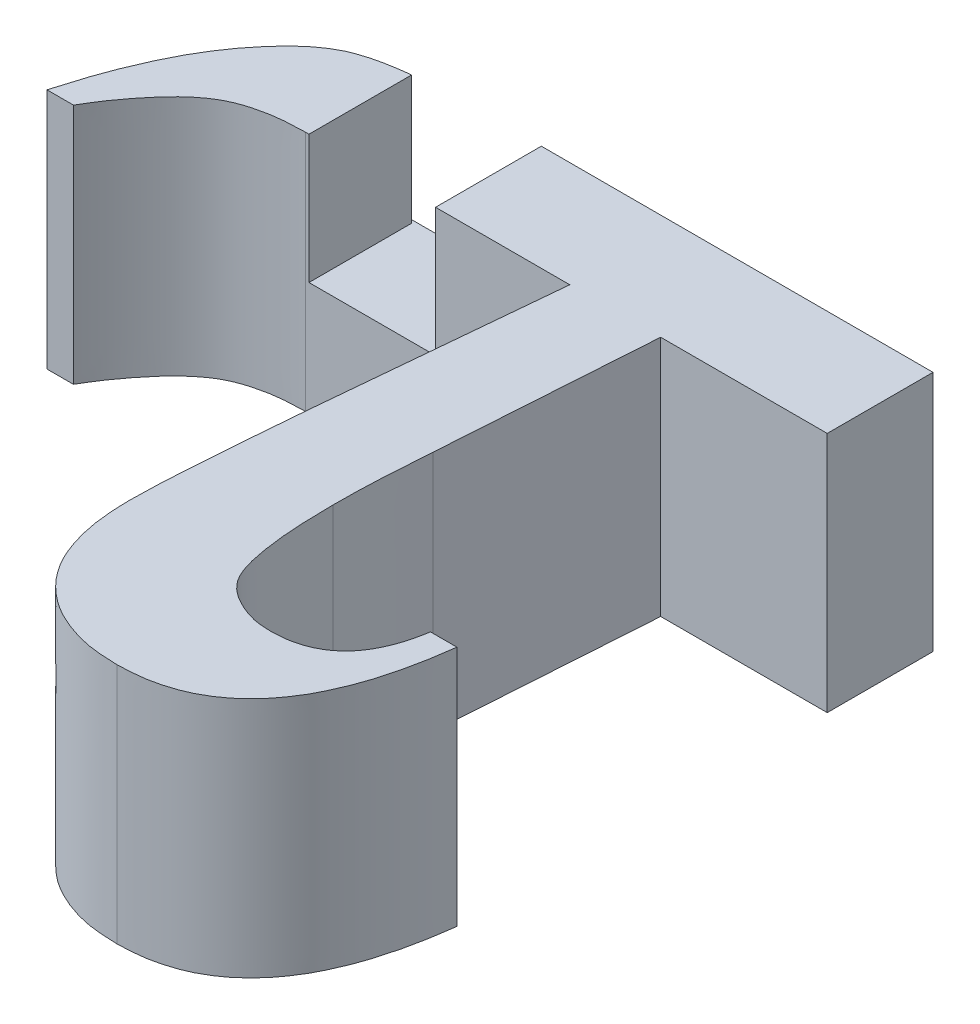
ISO-10303-21;
HEADER;
FILE_DESCRIPTION(('STEP AP214'),'2;1');
FILE_NAME('part.step','',(''),(''),'','','');
FILE_SCHEMA(('AUTOMOTIVE_DESIGN { 1 0 10303 214 1 1 1 1 }'));
ENDSEC;
DATA;
#1=APPLICATION_CONTEXT('core data for automotive mechanical design processes');
#2=APPLICATION_PROTOCOL_DEFINITION('international standard','automotive_design',2000,#1);
#3=PRODUCT_CONTEXT('',#1,'mechanical');
#4=PRODUCT('Part','Part','',(#3));
#5=PRODUCT_RELATED_PRODUCT_CATEGORY('part','',(#4));
#6=PRODUCT_DEFINITION_FORMATION('','',#4);
#7=PRODUCT_DEFINITION_CONTEXT('part definition',#1,'design');
#8=PRODUCT_DEFINITION('design','',#6,#7);
#9=PRODUCT_DEFINITION_SHAPE('','',#8);
#10=(LENGTH_UNIT() NAMED_UNIT(*) SI_UNIT(.MILLI.,.METRE.));
#11=(NAMED_UNIT(*) PLANE_ANGLE_UNIT() SI_UNIT($,.RADIAN.));
#12=(NAMED_UNIT(*) SI_UNIT($,.STERADIAN.) SOLID_ANGLE_UNIT());
#13=UNCERTAINTY_MEASURE_WITH_UNIT(LENGTH_MEASURE(1.E-05),#10,'distance_accuracy_value','');
#14=(GEOMETRIC_REPRESENTATION_CONTEXT(3) GLOBAL_UNCERTAINTY_ASSIGNED_CONTEXT((#13)) GLOBAL_UNIT_ASSIGNED_CONTEXT((#10,
#11,#12)) REPRESENTATION_CONTEXT('',''));
#15=CARTESIAN_POINT('',(0.,0.,0.));
#16=DIRECTION('',(0.,0.,1.));
#17=DIRECTION('',(1.,0.,0.));
#18=AXIS2_PLACEMENT_3D('',#15,#16,#17);
#19=CARTESIAN_POINT('',(13.2921006944444,12.7,-34.0277777777778));
#20=DIRECTION('',(0.,0.,-1.));
#21=DIRECTION('',(-1.,0.,0.));
#22=AXIS2_PLACEMENT_3D('',#19,#20,#21);
#23=PLANE('',#22);
#24=DIRECTION('',(1.,0.,0.));
#25=VECTOR('',#24,1.);
#26=CARTESIAN_POINT('',(13.2921006944444,0.,-34.0277777777778));
#27=LINE('',#26,#25);
#28=CARTESIAN_POINT('',(9.23728241617339,0.,-34.0277777777778));
#29=VERTEX_POINT('',#28);
#30=CARTESIAN_POINT('',(36.8055555555556,0.,-34.0277777777778));
#31=VERTEX_POINT('',#30);
#32=EDGE_CURVE('E272',#29,#31,#27,.T.);
#33=ORIENTED_EDGE('',*,*,#32,.F.);
#34=DIRECTION('',(0.,-1.,0.));
#35=VECTOR('',#34,1.);
#36=CARTESIAN_POINT('',(9.23728241617339,0.,-34.0277777777778));
#37=LINE('',#36,#35);
#38=CARTESIAN_POINT('',(9.23728241617339,5.95424376595588,-34.0277777777778));
#39=VERTEX_POINT('',#38);
#40=EDGE_CURVE('E457',#39,#29,#37,.T.);
#41=ORIENTED_EDGE('',*,*,#40,.F.);
#42=DIRECTION('',(1.,0.,0.));
#43=VECTOR('',#42,1.);
#44=CARTESIAN_POINT('',(9.23728241617339,5.95424376595588,-34.0277777777778));
#45=LINE('',#44,#43);
#46=CARTESIAN_POINT('',(16.2372824161734,5.95424376595588,-34.0277777777778));
#47=VERTEX_POINT('',#46);
#48=EDGE_CURVE('E453',#39,#47,#45,.T.);
#49=ORIENTED_EDGE('',*,*,#48,.T.);
#50=DIRECTION('',(0.,-1.,0.));
#51=VECTOR('',#50,1.);
#52=CARTESIAN_POINT('',(16.2372824161734,12.700012,-34.0277777777778));
#53=LINE('',#52,#51);
#54=CARTESIAN_POINT('',(16.2372824161734,12.7,-34.0277777777778));
#55=VERTEX_POINT('',#54);
#56=EDGE_CURVE('E440',#55,#47,#53,.T.);
#57=ORIENTED_EDGE('',*,*,#56,.F.);
#58=DIRECTION('',(1.,0.,0.));
#59=VECTOR('',#58,1.);
#60=CARTESIAN_POINT('',(13.2921006944444,12.7,-34.0277777777778));
#61=LINE('',#60,#59);
#62=CARTESIAN_POINT('',(36.8055555555556,12.7,-34.0277777777778));
#63=VERTEX_POINT('',#62);
#64=EDGE_CURVE('E464',#55,#63,#61,.T.);
#65=ORIENTED_EDGE('',*,*,#64,.T.);
#66=DIRECTION('',(0.,-1.,0.));
#67=VECTOR('',#66,1.);
#68=CARTESIAN_POINT('',(36.8055555555556,12.7,-34.0277777777778));
#69=LINE('',#68,#67);
#70=EDGE_CURVE('E467',#63,#31,#69,.T.);
#71=ORIENTED_EDGE('',*,*,#70,.T.);
#72=EDGE_LOOP('',(#33,#41,#49,#57,#65,#71));
#73=FACE_BOUND('',#72,.T.);
#74=ADVANCED_FACE('F33',(#73),#23,.T.);
#75=CARTESIAN_POINT('',(23.2855902777778,12.7,-28.4722222222222));
#76=DIRECTION('',(0.,0.,1.));
#77=DIRECTION('',(1.,0.,0.));
#78=AXIS2_PLACEMENT_3D('',#75,#76,#77);
#79=PLANE('',#78);
#80=DIRECTION('',(0.,-1.,0.));
#81=VECTOR('',#80,1.);
#82=CARTESIAN_POINT('',(9.40755208333333,12.7,-28.4722222222222));
#83=LINE('',#82,#81);
#84=CARTESIAN_POINT('',(9.40755208333333,12.7,-28.4722222222222));
#85=VERTEX_POINT('',#84);
#86=CARTESIAN_POINT('',(9.40755208333333,0.,-28.4722222222222));
#87=VERTEX_POINT('',#86);
#88=EDGE_CURVE('E200',#85,#87,#83,.T.);
#89=ORIENTED_EDGE('',*,*,#88,.T.);
#90=DIRECTION('',(-1.,0.,0.));
#91=VECTOR('',#90,1.);
#92=CARTESIAN_POINT('',(23.2855902777778,0.,-28.4722222222222));
#93=LINE('',#92,#91);
#94=CARTESIAN_POINT('',(23.2855902777778,0.,-28.4722222222222));
#95=VERTEX_POINT('',#94);
#96=EDGE_CURVE('E264',#95,#87,#93,.T.);
#97=ORIENTED_EDGE('',*,*,#96,.F.);
#98=DIRECTION('',(0.,-1.,0.));
#99=VECTOR('',#98,1.);
#100=CARTESIAN_POINT('',(23.2855902777778,12.7,-28.4722222222222));
#101=LINE('',#100,#99);
#102=CARTESIAN_POINT('',(23.2855902777778,12.7,-28.4722222222222));
#103=VERTEX_POINT('',#102);
#104=EDGE_CURVE('E282',#103,#95,#101,.T.);
#105=ORIENTED_EDGE('',*,*,#104,.F.);
#106=DIRECTION('',(-1.,0.,0.));
#107=VECTOR('',#106,1.);
#108=CARTESIAN_POINT('',(23.2855902777778,12.7,-28.4722222222222));
#109=LINE('',#108,#107);
#110=CARTESIAN_POINT('',(16.2372824161734,12.7,-28.4722222222222));
#111=VERTEX_POINT('',#110);
#112=EDGE_CURVE('E278',#103,#111,#109,.T.);
#113=ORIENTED_EDGE('',*,*,#112,.T.);
#114=DIRECTION('',(0.,-1.,0.));
#115=VECTOR('',#114,1.);
#116=CARTESIAN_POINT('',(16.2372824161734,12.700012,-28.4722222222222));
#117=LINE('',#116,#115);
#118=CARTESIAN_POINT('',(16.2372824161734,5.95424376595588,-28.4722222222222));
#119=VERTEX_POINT('',#118);
#120=EDGE_CURVE('E273',#111,#119,#117,.T.);
#121=ORIENTED_EDGE('',*,*,#120,.T.);
#122=DIRECTION('',(1.,0.,0.));
#123=VECTOR('',#122,1.);
#124=CARTESIAN_POINT('',(9.23728241617339,5.95424376595588,-28.4722222222222));
#125=LINE('',#124,#123);
#126=CARTESIAN_POINT('',(9.59139239565676,5.95424376595588,-28.4722222222222));
#127=VERTEX_POINT('',#126);
#128=EDGE_CURVE('E56',#127,#119,#125,.T.);
#129=ORIENTED_EDGE('',*,*,#128,.F.);
#130=DIRECTION('',(0.,-1.,0.));
#131=VECTOR('',#130,1.);
#132=CARTESIAN_POINT('',(9.59139239565676,12.700012,-28.4722222222222));
#133=LINE('',#132,#131);
#134=CARTESIAN_POINT('',(9.59139239565676,12.7,-28.4722222222222));
#135=VERTEX_POINT('',#134);
#136=EDGE_CURVE('E182',#135,#127,#133,.T.);
#137=ORIENTED_EDGE('',*,*,#136,.F.);
#138=DIRECTION('',(-1.,0.,0.));
#139=VECTOR('',#138,1.);
#140=CARTESIAN_POINT('',(11.8055555555556,12.7,-28.4722222222222));
#141=LINE('',#140,#139);
#142=EDGE_CURVE('E192',#135,#85,#141,.T.);
#143=ORIENTED_EDGE('',*,*,#142,.T.);
#144=EDGE_LOOP('',(#89,#97,#105,#113,#121,#129,#137,#143));
#145=FACE_BOUND('',#144,.T.);
#146=ADVANCED_FACE('F263',(#145),#79,.T.);
#147=CARTESIAN_POINT('',(27.1472873942856,12.7,-14.7536617724148));
#148=DIRECTION('',(0.,-1.,0.));
#149=DIRECTION('',(0.,0.,-1.));
#150=AXIS2_PLACEMENT_3D('',#147,#148,#149);
#151=PLANE('',#150);
#152=DIRECTION('',(0.,0.,1.));
#153=VECTOR('',#152,1.);
#154=CARTESIAN_POINT('',(16.2372824161734,12.7,0.));
#155=LINE('',#154,#153);
#156=EDGE_CURVE('E442',#111,#55,#155,.F.);
#157=ORIENTED_EDGE('',*,*,#156,.F.);
#158=ORIENTED_EDGE('',*,*,#112,.F.);
#159=DIRECTION('',(0.0934043008907482,0.,-0.995628262242043));
#160=VECTOR('',#159,1.);
#161=CARTESIAN_POINT('',(22.2981770833333,12.7,-17.9470486111111));
#162=LINE('',#161,#160);
#163=CARTESIAN_POINT('',(22.2981770833333,12.7,-17.9470486111111));
#164=VERTEX_POINT('',#163);
#165=EDGE_CURVE('E285',#164,#103,#162,.T.);
#166=ORIENTED_EDGE('',*,*,#165,.F.);
#167=CARTESIAN_POINT('',(21.5277777777778,12.7,-7.12890625));
#168=CARTESIAN_POINT('',(21.5305114105295,12.7,-7.3712541198442));
#169=CARTESIAN_POINT('',(21.5366740874699,12.7,-7.91760096473992));
#170=CARTESIAN_POINT('',(21.5693216726704,12.7,-8.8258732238135));
#171=CARTESIAN_POINT('',(21.639359606474,12.7,-9.91058564289095));
#172=CARTESIAN_POINT('',(21.7259965981165,12.7,-11.1729046276854));
#173=CARTESIAN_POINT('',(21.83463501765,12.7,-12.6124561829459));
#174=CARTESIAN_POINT('',(21.9665895696574,12.7,-14.2326908476133));
#175=CARTESIAN_POINT('',(22.1147351358337,12.7,-16.0309685855275));
#176=CARTESIAN_POINT('',(22.2351680357019,12.7,-17.2889091874774));
#177=CARTESIAN_POINT('',(22.2981770833333,12.7,-17.9470486111111));
#178=B_SPLINE_CURVE_WITH_KNOTS('',3,(#167,#168,#169,#170,#171,#172,#173,#174,#175,#176,#177),
.UNSPECIFIED.,.F.,.F.,(4,1,1,1,1,1,1,1,4),(0.,0.0670238303360388,0.151097916645444,
0.251302226093075,0.367606163812109,0.501014153754002,0.65053310860966,0.817163117143853,1.),.UNSPECIFIED.);
#179=CARTESIAN_POINT('',(21.5277777777778,12.7,-7.12890625));
#180=VERTEX_POINT('',#179);
#181=EDGE_CURVE('E346',#180,#164,#178,.T.);
#182=ORIENTED_EDGE('',*,*,#181,.F.);
#183=CARTESIAN_POINT('',(28.6675347222222,12.7,0.694444444444444));
#184=CARTESIAN_POINT('',(28.1546828613466,12.7,0.675816782086769));
#185=CARTESIAN_POINT('',(27.1641312430192,12.7,0.639838242275));
#186=CARTESIAN_POINT('',(25.7663350443405,12.7,0.242024900702383));
#187=CARTESIAN_POINT('',(24.5121456190193,12.7,-0.369174112416068));
#188=CARTESIAN_POINT('',(23.6216090508016,12.7,-1.10102614918808));
#189=CARTESIAN_POINT('',(23.0102559111378,12.7,-1.79721088235984));
#190=CARTESIAN_POINT('',(22.6098523705465,12.7,-2.38381706075308));
#191=CARTESIAN_POINT('',(22.2684789361821,12.7,-3.03085897121243));
#192=CARTESIAN_POINT('',(22.0031010816414,12.7,-3.74048733214159));
#193=CARTESIAN_POINT('',(21.7829659020023,12.7,-4.50131584322859));
#194=CARTESIAN_POINT('',(21.632459474962,12.7,-5.32264207193387));
#195=CARTESIAN_POINT('',(21.5478756365024,12.7,-6.20479876889942));
#196=CARTESIAN_POINT('',(21.534625409571,12.7,-6.81404943591648));
#197=CARTESIAN_POINT('',(21.5277777777778,12.7,-7.12890625));
#198=B_SPLINE_CURVE_WITH_KNOTS('',3,(#183,#184,#185,#186,#187,#188,#189,#190,#191,#192,#193,
#194,#195,#196,#197),.UNSPECIFIED.,.F.,.F.,(4,1,1,1,1,1,1,1,1,1,1,1,4),(0.,0.127647226661698,
0.246545204552585,0.359563226304089,0.473742938345104,0.531308817831562,0.590390123598073,
0.650544045709061,0.713399872205537,0.779107018641923,0.847968041860642,0.921430864880289,1.),.UNSPECIFIED.);
#199=CARTESIAN_POINT('',(28.6675347222222,12.7,0.694444444444444));
#200=VERTEX_POINT('',#199);
#201=EDGE_CURVE('E353',#200,#180,#198,.T.);
#202=ORIENTED_EDGE('',*,*,#201,.F.);
#203=CARTESIAN_POINT('',(36.8055555555556,12.7,-9.02777777777778));
#204=CARTESIAN_POINT('',(36.7513133917469,12.7,-8.63659364157587));
#205=CARTESIAN_POINT('',(36.6454306414474,12.7,-7.87298744841802));
#206=CARTESIAN_POINT('',(36.4309932767515,12.7,-6.77107907621159));
#207=CARTESIAN_POINT('',(36.16669150045,12.7,-5.74350517199164));
#208=CARTESIAN_POINT('',(35.8738258854762,12.7,-4.78809617206142));
#209=CARTESIAN_POINT('',(35.5036386424438,12.7,-3.9183087219052));
#210=CARTESIAN_POINT('',(35.1264384283411,12.7,-3.10889015714418));
#211=CARTESIAN_POINT('',(34.6702223597116,12.7,-2.39005292028029));
#212=CARTESIAN_POINT('',(34.1904600364056,12.7,-1.73473575157518));
#213=CARTESIAN_POINT('',(33.6477015498479,12.7,-1.16770850492629));
#214=CARTESIAN_POINT('',(33.078282467188,12.7,-0.66136398505755));
#215=CARTESIAN_POINT('',(32.4475265168622,12.7,-0.251271838106295));
#216=CARTESIAN_POINT('',(31.7856191750121,12.7,0.107880779261864));
#217=CARTESIAN_POINT('',(31.0640591850801,12.7,0.356214557009295));
#218=CARTESIAN_POINT('',(30.3088261221695,12.7,0.56350053559861));
#219=CARTESIAN_POINT('',(29.5020634030454,12.7,0.664205140721047));
#220=CARTESIAN_POINT('',(28.9498434871648,12.7,0.684214933244837));
#221=CARTESIAN_POINT('',(28.6675347222222,12.7,0.694444444444444));
#222=B_SPLINE_CURVE_WITH_KNOTS('',3,(#203,#204,#205,#206,#207,#208,#209,#210,#211,#212,#213,
#214,#215,#216,#217,#218,#219,#220,#221),.UNSPECIFIED.,.F.,.F.,(4,1,1,1,1,1,1,1,1,1,1,1,1,1,1,1,
4),(0.,0.0841556864895232,0.164275075203153,0.239055219457782,0.310237014412085,
0.376941840256964,0.440373169741991,0.500263392341492,0.558073875988856,0.613147443853041,
0.667241364146044,0.720045825452029,0.773142026333451,0.827274375356327,0.882239955728648,
0.93979809184389,1.),.UNSPECIFIED.);
#223=CARTESIAN_POINT('',(36.8055555555556,12.7,-9.02777777777778));
#224=VERTEX_POINT('',#223);
#225=EDGE_CURVE('E484',#224,#200,#222,.T.);
#226=ORIENTED_EDGE('',*,*,#225,.F.);
#227=DIRECTION('',(1.,0.,0.));
#228=VECTOR('',#227,1.);
#229=CARTESIAN_POINT('',(35.4166666666667,12.7,-9.02777777777778));
#230=LINE('',#229,#228);
#231=CARTESIAN_POINT('',(35.4166666666667,12.7,-9.02777777777778));
#232=VERTEX_POINT('',#231);
#233=EDGE_CURVE('E481',#232,#224,#230,.T.);
#234=ORIENTED_EDGE('',*,*,#233,.F.);
#235=CARTESIAN_POINT('',(31.1957465277778,12.7,-4.86111111111111));
#236=CARTESIAN_POINT('',(31.4791658501184,12.7,-4.8721360880485));
#237=CARTESIAN_POINT('',(32.020929674091,12.7,-4.89321063446786));
#238=CARTESIAN_POINT('',(32.7882207905975,12.7,-5.09409905053723));
#239=CARTESIAN_POINT('',(33.4661075286299,12.7,-5.42321156735885));
#240=CARTESIAN_POINT('',(34.0525941602721,12.7,-5.89132585546645));
#241=CARTESIAN_POINT('',(34.5489539983316,12.7,-6.48840022572338));
#242=CARTESIAN_POINT('',(34.9362207251512,12.7,-7.22238630970373));
#243=CARTESIAN_POINT('',(35.2449863982341,12.7,-8.07647376134501));
#244=CARTESIAN_POINT('',(35.3574861135008,12.7,-8.69985018053333));
#245=CARTESIAN_POINT('',(35.4166666666667,12.7,-9.02777777777778));
#246=B_SPLINE_CURVE_WITH_KNOTS('',3,(#235,#236,#237,#238,#239,#240,#241,#242,#243,#244,#245),
.UNSPECIFIED.,.F.,.F.,(4,1,1,1,1,1,1,1,4),(0.,0.129205983290068,0.246980788074976,
0.35925367724387,0.470941934680579,0.587037155352566,0.711204670771874,0.848079016956545,1.),.UNSPECIFIED.);
#247=CARTESIAN_POINT('',(31.1957465277778,12.7,-4.86111111111111));
#248=VERTEX_POINT('',#247);
#249=EDGE_CURVE('E478',#248,#232,#246,.T.);
#250=ORIENTED_EDGE('',*,*,#249,.F.);
#251=CARTESIAN_POINT('',(27.0833333333333,12.7,-12.2287326388889));
#252=CARTESIAN_POINT('',(27.0882745812644,12.7,-11.8236043185145));
#253=CARTESIAN_POINT('',(27.0976765216824,12.7,-11.052747971514));
#254=CARTESIAN_POINT('',(27.1463748998904,12.7,-9.95891993945998));
#255=CARTESIAN_POINT('',(27.2451702705584,12.7,-8.98875586176693));
#256=CARTESIAN_POINT('',(27.3710026926128,12.7,-8.14392613457271));
#257=CARTESIAN_POINT('',(27.5291522325583,12.7,-7.41943052756003));
#258=CARTESIAN_POINT('',(27.7284573341644,12.7,-6.81830163856045));
#259=CARTESIAN_POINT('',(27.9765063600137,12.7,-6.33946446408178));
#260=CARTESIAN_POINT('',(28.3522272213898,12.7,-5.8784454175766));
#261=CARTESIAN_POINT('',(28.9025466939934,12.7,-5.47047020970769));
#262=CARTESIAN_POINT('',(29.6120223329737,12.7,-5.12581615996723));
#263=CARTESIAN_POINT('',(30.3815459637492,12.7,-4.88809905815676));
#264=CARTESIAN_POINT('',(30.9190270918066,12.7,-4.87028340822614));
#265=CARTESIAN_POINT('',(31.1957465277778,12.7,-4.86111111111111));
#266=B_SPLINE_CURVE_WITH_KNOTS('',3,(#251,#252,#253,#254,#255,#256,#257,#258,#259,#260,#261,
#262,#263,#264,#265),.UNSPECIFIED.,.F.,.F.,(4,1,1,1,1,1,1,1,1,1,1,1,4),(0.,0.125676685120686,
0.239130827254309,0.339492232966841,0.42803269094699,0.503968671969276,0.56925330075194,
0.623964141319684,0.670222681451672,0.752583670617675,0.83386779813621,0.914467677474434,1.),.UNSPECIFIED.);
#267=CARTESIAN_POINT('',(27.0833333333333,12.7,-12.2287326388889));
#268=VERTEX_POINT('',#267);
#269=EDGE_CURVE('E420',#268,#248,#266,.T.);
#270=ORIENTED_EDGE('',*,*,#269,.F.);
#271=CARTESIAN_POINT('',(27.3111979166667,12.7,-17.2743055555556));
#272=CARTESIAN_POINT('',(27.2777956556052,12.7,-16.8041666391725));
#273=CARTESIAN_POINT('',(27.2135818740465,12.7,-15.9003536421008));
#274=CARTESIAN_POINT('',(27.1342842848992,12.7,-14.5912792307124));
#275=CARTESIAN_POINT('',(27.0883448225416,12.7,-13.379251722667));
#276=CARTESIAN_POINT('',(27.0849562140775,12.7,-12.6013075740456));
#277=CARTESIAN_POINT('',(27.0833333333333,12.7,-12.2287326388889));
#278=B_SPLINE_CURVE_WITH_KNOTS('',3,(#271,#272,#273,#274,#275,#276,#277),.UNSPECIFIED.,.F.,.F.,
(4,1,1,1,4),(0.,0.279883091977313,0.538057938568128,0.778765565768248,1.),.UNSPECIFIED.);
#279=CARTESIAN_POINT('',(27.3111979166667,12.7,-17.2743055555556));
#280=VERTEX_POINT('',#279);
#281=EDGE_CURVE('E412',#280,#268,#278,.T.);
#282=ORIENTED_EDGE('',*,*,#281,.F.);
#283=DIRECTION('',(-0.0667115204065151,0.,0.997772305210488));
#284=VECTOR('',#283,1.);
#285=CARTESIAN_POINT('',(28.0598958333333,12.7,-28.4722222222222));
#286=LINE('',#285,#284);
#287=CARTESIAN_POINT('',(28.0598958333333,12.7,-28.4722222222222));
#288=VERTEX_POINT('',#287);
#289=EDGE_CURVE('E425',#288,#280,#286,.T.);
#290=ORIENTED_EDGE('',*,*,#289,.F.);
#291=DIRECTION('',(-1.,0.,0.));
#292=VECTOR('',#291,1.);
#293=CARTESIAN_POINT('',(36.8055555555556,12.7,-28.4722222222222));
#294=LINE('',#293,#292);
#295=CARTESIAN_POINT('',(36.8055555555556,12.7,-28.4722222222222));
#296=VERTEX_POINT('',#295);
#297=EDGE_CURVE('E432',#296,#288,#294,.T.);
#298=ORIENTED_EDGE('',*,*,#297,.F.);
#299=DIRECTION('',(0.,0.,1.));
#300=VECTOR('',#299,1.);
#301=CARTESIAN_POINT('',(36.8055555555556,12.7,-34.0277777777778));
#302=LINE('',#301,#300);
#303=EDGE_CURVE('E436',#63,#296,#302,.T.);
#304=ORIENTED_EDGE('',*,*,#303,.F.);
#305=ORIENTED_EDGE('',*,*,#64,.F.);
#306=EDGE_LOOP('',(#157,#158,#166,#182,#202,#226,#234,#250,#270,#282,#290,#298,#304,#305));
#307=FACE_BOUND('',#306,.T.);
#308=ADVANCED_FACE('F35',(#307),#151,.F.);
#309=CARTESIAN_POINT('',(27.1472873942856,0.,-14.7536617724148));
#310=DIRECTION('',(0.,-1.,0.));
#311=DIRECTION('',(0.,0.,-1.));
#312=AXIS2_PLACEMENT_3D('',#309,#310,#311);
#313=PLANE('',#312);
#314=ORIENTED_EDGE('',*,*,#96,.T.);
#315=CARTESIAN_POINT('',(9.40755208333333,0.,-28.4722222222222));
#316=CARTESIAN_POINT('',(8.95408519576781,0.,-28.4606206709391));
#317=CARTESIAN_POINT('',(8.09430128908974,0.,-28.4386238562671));
#318=CARTESIAN_POINT('',(6.89073280513659,0.,-28.1966385268821));
#319=CARTESIAN_POINT('',(5.84213085109311,0.,-27.8179401102908));
#320=CARTESIAN_POINT('',(4.96956885236203,0.,-27.2299365275539));
#321=CARTESIAN_POINT('',(4.19796483569046,0.,-26.5149213859107));
#322=CARTESIAN_POINT('',(3.4764642398158,0.,-25.6630991056384));
#323=CARTESIAN_POINT('',(2.73941358764486,0.,-24.7044655684062));
#324=CARTESIAN_POINT('',(2.30762444937789,0.,-23.9848911324537));
#325=CARTESIAN_POINT('',(2.08333333333333,0.,-23.6111111111111));
#326=B_SPLINE_CURVE_WITH_KNOTS('',3,(#315,#316,#317,#318,#319,#320,#321,#322,#323,#324,#325),
.UNSPECIFIED.,.F.,.F.,(4,1,1,1,1,1,1,1,4),(0.,0.145583771362849,0.276030261797652,
0.393080050750592,0.501449771885324,0.611742725661537,0.730433023859637,0.859974527914375,1.),.UNSPECIFIED.);
#327=CARTESIAN_POINT('',(2.08333333333333,0.,-23.6111111111111));
#328=VERTEX_POINT('',#327);
#329=EDGE_CURVE('E193',#87,#328,#326,.T.);
#330=ORIENTED_EDGE('',*,*,#329,.T.);
#331=DIRECTION('',(-1.,0.,0.));
#332=VECTOR('',#331,1.);
#333=CARTESIAN_POINT('',(2.08333333333333,0.,-23.6111111111111));
#334=LINE('',#333,#332);
#335=CARTESIAN_POINT('',(0.694444444444444,0.,-23.6111111111111));
#336=VERTEX_POINT('',#335);
#337=EDGE_CURVE('E240',#328,#336,#334,.T.);
#338=ORIENTED_EDGE('',*,*,#337,.T.);
#339=CARTESIAN_POINT('',(0.694444444444444,0.,-23.6111111111111));
#340=CARTESIAN_POINT('',(0.877085400927211,0.,-24.2325973935134));
#341=CARTESIAN_POINT('',(1.22929100018624,0.,-25.4310741905039));
#342=CARTESIAN_POINT('',(1.88626697778044,0.,-27.1198883334908));
#343=CARTESIAN_POINT('',(2.60411941982457,0.,-28.6425685555125));
#344=CARTESIAN_POINT('',(3.40397478963898,0.,-29.9807064863556));
#345=CARTESIAN_POINT('',(4.25911175599265,0.,-31.1159816153702));
#346=CARTESIAN_POINT('',(5.11851784470723,0.,-32.0589555969846));
#347=CARTESIAN_POINT('',(5.99667254096802,0.,-32.7858615843168));
#348=CARTESIAN_POINT('',(6.77259028848232,0.,-33.2248506339241));
#349=CARTESIAN_POINT('',(7.44907428146499,0.,-33.4555232845119));
#350=CARTESIAN_POINT('',(8.02710412470257,0.,-33.6193269548779));
#351=CARTESIAN_POINT('',(8.69603133437619,0.,-33.7433975237279));
#352=CARTESIAN_POINT('',(9.44462384368619,0.,-33.8557901627339));
#353=CARTESIAN_POINT('',(10.2860205496014,0.,-33.9218814942938));
#354=CARTESIAN_POINT('',(11.2112875792302,0.,-33.9939424882169));
#355=CARTESIAN_POINT('',(12.2249683095544,0.,-34.020966417384));
#356=CARTESIAN_POINT('',(12.926797760704,0.,-34.0254460990003));
#357=CARTESIAN_POINT('',(13.2921006944444,0.,-34.0277777777778));
#358=B_SPLINE_CURVE_WITH_KNOTS('',3,(#339,#340,#341,#342,#343,#344,#345,#346,#347,#348,#349,
#350,#351,#352,#353,#354,#355,#356,#357),.UNSPECIFIED.,.F.,.F.,(4,1,1,1,1,1,1,1,1,1,1,1,1,1,1,1,
4),(0.,0.106389814768358,0.205162572443508,0.297397502260976,0.382702081516378,
0.460789650769703,0.530590808939293,0.5918470728537,0.647433049944165,0.675815421325624,
0.709121231619287,0.746066666669912,0.787499901970603,0.833447624649006,0.884679338709788,
0.939975480052583,1.),.UNSPECIFIED.);
#359=CARTESIAN_POINT('',(9.23728241617339,0.,-33.820866412652));
#360=VERTEX_POINT('',#359);
#361=EDGE_CURVE('E246',#336,#360,#358,.T.);
#362=ORIENTED_EDGE('',*,*,#361,.T.);
#363=DIRECTION('',(0.,0.,1.));
#364=VECTOR('',#363,1.);
#365=CARTESIAN_POINT('',(9.23728241617339,0.,-34.0277777777778));
#366=LINE('',#365,#364);
#367=EDGE_CURVE('E451',#29,#360,#366,.T.);
#368=ORIENTED_EDGE('',*,*,#367,.F.);
#369=ORIENTED_EDGE('',*,*,#32,.T.);
#370=DIRECTION('',(0.,0.,1.));
#371=VECTOR('',#370,1.);
#372=CARTESIAN_POINT('',(36.8055555555556,0.,-34.0277777777778));
#373=LINE('',#372,#371);
#374=CARTESIAN_POINT('',(36.8055555555556,0.,-28.4722222222222));
#375=VERTEX_POINT('',#374);
#376=EDGE_CURVE('E275',#31,#375,#373,.T.);
#377=ORIENTED_EDGE('',*,*,#376,.T.);
#378=DIRECTION('',(-1.,0.,0.));
#379=VECTOR('',#378,1.);
#380=CARTESIAN_POINT('',(36.8055555555556,0.,-28.4722222222222));
#381=LINE('',#380,#379);
#382=CARTESIAN_POINT('',(28.0598958333333,0.,-28.4722222222222));
#383=VERTEX_POINT('',#382);
#384=EDGE_CURVE('E339',#375,#383,#381,.T.);
#385=ORIENTED_EDGE('',*,*,#384,.T.);
#386=DIRECTION('',(-0.0667115204065151,0.,0.997772305210488));
#387=VECTOR('',#386,1.);
#388=CARTESIAN_POINT('',(28.0598958333333,0.,-28.4722222222222));
#389=LINE('',#388,#387);
#390=CARTESIAN_POINT('',(27.3111979166667,0.,-17.2743055555556));
#391=VERTEX_POINT('',#390);
#392=EDGE_CURVE('E333',#383,#391,#389,.T.);
#393=ORIENTED_EDGE('',*,*,#392,.T.);
#394=CARTESIAN_POINT('',(27.3111979166667,0.,-17.2743055555556));
#395=CARTESIAN_POINT('',(27.2777956556052,0.,-16.8041666391725));
#396=CARTESIAN_POINT('',(27.2135818740465,0.,-15.9003536421008));
#397=CARTESIAN_POINT('',(27.1342842848992,0.,-14.5912792307124));
#398=CARTESIAN_POINT('',(27.0883448225416,0.,-13.379251722667));
#399=CARTESIAN_POINT('',(27.0849562140775,0.,-12.6013075740456));
#400=CARTESIAN_POINT('',(27.0833333333333,0.,-12.2287326388889));
#401=B_SPLINE_CURVE_WITH_KNOTS('',3,(#394,#395,#396,#397,#398,#399,#400),.UNSPECIFIED.,.F.,.F.,
(4,1,1,1,4),(0.,0.279883091977313,0.538057938568128,0.778765565768248,1.),.UNSPECIFIED.);
#402=CARTESIAN_POINT('',(27.0833333333333,0.,-12.2287326388889));
#403=VERTEX_POINT('',#402);
#404=EDGE_CURVE('E325',#391,#403,#401,.T.);
#405=ORIENTED_EDGE('',*,*,#404,.T.);
#406=CARTESIAN_POINT('',(27.0833333333333,0.,-12.2287326388889));
#407=CARTESIAN_POINT('',(27.0882745812644,0.,-11.8236043185145));
#408=CARTESIAN_POINT('',(27.0976765216824,0.,-11.052747971514));
#409=CARTESIAN_POINT('',(27.1463748998904,0.,-9.95891993945998));
#410=CARTESIAN_POINT('',(27.2451702705584,0.,-8.98875586176693));
#411=CARTESIAN_POINT('',(27.3710026926128,0.,-8.14392613457271));
#412=CARTESIAN_POINT('',(27.5291522325583,0.,-7.41943052756003));
#413=CARTESIAN_POINT('',(27.7284573341644,0.,-6.81830163856045));
#414=CARTESIAN_POINT('',(27.9765063600137,0.,-6.33946446408178));
#415=CARTESIAN_POINT('',(28.3522272213898,0.,-5.8784454175766));
#416=CARTESIAN_POINT('',(28.9025466939934,0.,-5.47047020970769));
#417=CARTESIAN_POINT('',(29.6120223329737,0.,-5.12581615996723));
#418=CARTESIAN_POINT('',(30.3815459637492,0.,-4.88809905815676));
#419=CARTESIAN_POINT('',(30.9190270918066,0.,-4.87028340822614));
#420=CARTESIAN_POINT('',(31.1957465277778,0.,-4.86111111111111));
#421=B_SPLINE_CURVE_WITH_KNOTS('',3,(#406,#407,#408,#409,#410,#411,#412,#413,#414,#415,#416,
#417,#418,#419,#420),.UNSPECIFIED.,.F.,.F.,(4,1,1,1,1,1,1,1,1,1,1,1,4),(0.,0.125676685120686,
0.239130827254309,0.339492232966841,0.42803269094699,0.503968671969276,0.56925330075194,
0.623964141319684,0.670222681451672,0.752583670617675,0.83386779813621,0.914467677474434,1.),.UNSPECIFIED.);
#422=CARTESIAN_POINT('',(31.1957465277778,0.,-4.86111111111111));
#423=VERTEX_POINT('',#422);
#424=EDGE_CURVE('E317',#403,#423,#421,.T.);
#425=ORIENTED_EDGE('',*,*,#424,.T.);
#426=CARTESIAN_POINT('',(31.1957465277778,0.,-4.86111111111111));
#427=CARTESIAN_POINT('',(31.4791658501184,0.,-4.8721360880485));
#428=CARTESIAN_POINT('',(32.020929674091,0.,-4.89321063446786));
#429=CARTESIAN_POINT('',(32.7882207905975,0.,-5.09409905053723));
#430=CARTESIAN_POINT('',(33.4661075286299,0.,-5.42321156735885));
#431=CARTESIAN_POINT('',(34.0525941602721,0.,-5.89132585546645));
#432=CARTESIAN_POINT('',(34.5489539983316,0.,-6.48840022572338));
#433=CARTESIAN_POINT('',(34.9362207251512,0.,-7.22238630970373));
#434=CARTESIAN_POINT('',(35.2449863982341,0.,-8.07647376134501));
#435=CARTESIAN_POINT('',(35.3574861135008,0.,-8.69985018053333));
#436=CARTESIAN_POINT('',(35.4166666666667,0.,-9.02777777777778));
#437=B_SPLINE_CURVE_WITH_KNOTS('',3,(#426,#427,#428,#429,#430,#431,#432,#433,#434,#435,#436),
.UNSPECIFIED.,.F.,.F.,(4,1,1,1,1,1,1,1,4),(0.,0.129205983290068,0.246980788074976,
0.35925367724387,0.470941934680579,0.587037155352566,0.711204670771874,0.848079016956545,1.),.UNSPECIFIED.);
#438=CARTESIAN_POINT('',(35.4166666666667,0.,-9.02777777777778));
#439=VERTEX_POINT('',#438);
#440=EDGE_CURVE('E312',#423,#439,#437,.T.);
#441=ORIENTED_EDGE('',*,*,#440,.T.);
#442=DIRECTION('',(1.,0.,0.));
#443=VECTOR('',#442,1.);
#444=CARTESIAN_POINT('',(35.4166666666667,0.,-9.02777777777778));
#445=LINE('',#444,#443);
#446=CARTESIAN_POINT('',(36.8055555555556,0.,-9.02777777777778));
#447=VERTEX_POINT('',#446);
#448=EDGE_CURVE('E306',#439,#447,#445,.T.);
#449=ORIENTED_EDGE('',*,*,#448,.T.);
#450=CARTESIAN_POINT('',(36.8055555555556,0.,-9.02777777777778));
#451=CARTESIAN_POINT('',(36.7513133917469,0.,-8.63659364157587));
#452=CARTESIAN_POINT('',(36.6454306414474,0.,-7.87298744841802));
#453=CARTESIAN_POINT('',(36.4309932767515,0.,-6.77107907621159));
#454=CARTESIAN_POINT('',(36.16669150045,0.,-5.74350517199164));
#455=CARTESIAN_POINT('',(35.8738258854762,0.,-4.78809617206142));
#456=CARTESIAN_POINT('',(35.5036386424438,0.,-3.9183087219052));
#457=CARTESIAN_POINT('',(35.1264384283411,0.,-3.10889015714418));
#458=CARTESIAN_POINT('',(34.6702223597116,0.,-2.39005292028029));
#459=CARTESIAN_POINT('',(34.1904600364056,0.,-1.73473575157518));
#460=CARTESIAN_POINT('',(33.6477015498479,0.,-1.16770850492629));
#461=CARTESIAN_POINT('',(33.078282467188,0.,-0.66136398505755));
#462=CARTESIAN_POINT('',(32.4475265168622,0.,-0.251271838106295));
#463=CARTESIAN_POINT('',(31.7856191750121,0.,0.107880779261864));
#464=CARTESIAN_POINT('',(31.0640591850801,0.,0.356214557009295));
#465=CARTESIAN_POINT('',(30.3088261221695,0.,0.56350053559861));
#466=CARTESIAN_POINT('',(29.5020634030454,0.,0.664205140721047));
#467=CARTESIAN_POINT('',(28.9498434871648,0.,0.684214933244837));
#468=CARTESIAN_POINT('',(28.6675347222222,0.,0.694444444444444));
#469=B_SPLINE_CURVE_WITH_KNOTS('',3,(#450,#451,#452,#453,#454,#455,#456,#457,#458,#459,#460,
#461,#462,#463,#464,#465,#466,#467,#468),.UNSPECIFIED.,.F.,.F.,(4,1,1,1,1,1,1,1,1,1,1,1,1,1,1,1,
4),(0.,0.0841556864895232,0.164275075203153,0.239055219457782,0.310237014412085,
0.376941840256964,0.440373169741991,0.500263392341492,0.558073875988856,0.613147443853041,
0.667241364146044,0.720045825452029,0.773142026333451,0.827274375356327,0.882239955728648,
0.93979809184389,1.),.UNSPECIFIED.);
#470=CARTESIAN_POINT('',(28.6675347222222,0.,0.694444444444444));
#471=VERTEX_POINT('',#470);
#472=EDGE_CURVE('E298',#447,#471,#469,.T.);
#473=ORIENTED_EDGE('',*,*,#472,.T.);
#474=CARTESIAN_POINT('',(28.6675347222222,0.,0.694444444444444));
#475=CARTESIAN_POINT('',(28.1546828613466,0.,0.675816782086769));
#476=CARTESIAN_POINT('',(27.1641312430192,0.,0.639838242275));
#477=CARTESIAN_POINT('',(25.7663350443405,0.,0.242024900702383));
#478=CARTESIAN_POINT('',(24.5121456190193,0.,-0.369174112416068));
#479=CARTESIAN_POINT('',(23.6216090508016,0.,-1.10102614918808));
#480=CARTESIAN_POINT('',(23.0102559111378,0.,-1.79721088235984));
#481=CARTESIAN_POINT('',(22.6098523705465,0.,-2.38381706075308));
#482=CARTESIAN_POINT('',(22.2684789361821,0.,-3.03085897121243));
#483=CARTESIAN_POINT('',(22.0031010816414,0.,-3.74048733214159));
#484=CARTESIAN_POINT('',(21.7829659020023,0.,-4.50131584322859));
#485=CARTESIAN_POINT('',(21.632459474962,0.,-5.32264207193387));
#486=CARTESIAN_POINT('',(21.5478756365024,0.,-6.20479876889942));
#487=CARTESIAN_POINT('',(21.534625409571,0.,-6.81404943591648));
#488=CARTESIAN_POINT('',(21.5277777777778,0.,-7.12890625));
#489=B_SPLINE_CURVE_WITH_KNOTS('',3,(#474,#475,#476,#477,#478,#479,#480,#481,#482,#483,#484,
#485,#486,#487,#488),.UNSPECIFIED.,.F.,.F.,(4,1,1,1,1,1,1,1,1,1,1,1,4),(0.,0.127647226661698,
0.246545204552585,0.359563226304089,0.473742938345104,0.531308817831562,0.590390123598073,
0.650544045709061,0.713399872205537,0.779107018641923,0.847968041860642,0.921430864880289,1.),.UNSPECIFIED.);
#490=CARTESIAN_POINT('',(21.5277777777778,0.,-7.12890625));
#491=VERTEX_POINT('',#490);
#492=EDGE_CURVE('E290',#471,#491,#489,.T.);
#493=ORIENTED_EDGE('',*,*,#492,.T.);
#494=CARTESIAN_POINT('',(21.5277777777778,0.,-7.12890625));
#495=CARTESIAN_POINT('',(21.5305114105295,0.,-7.3712541198442));
#496=CARTESIAN_POINT('',(21.5366740874699,0.,-7.91760096473992));
#497=CARTESIAN_POINT('',(21.5693216726704,0.,-8.8258732238135));
#498=CARTESIAN_POINT('',(21.639359606474,0.,-9.91058564289095));
#499=CARTESIAN_POINT('',(21.7259965981165,0.,-11.1729046276854));
#500=CARTESIAN_POINT('',(21.83463501765,0.,-12.6124561829459));
#501=CARTESIAN_POINT('',(21.9665895696574,0.,-14.2326908476133));
#502=CARTESIAN_POINT('',(22.1147351358337,0.,-16.0309685855275));
#503=CARTESIAN_POINT('',(22.2351680357019,0.,-17.2889091874774));
#504=CARTESIAN_POINT('',(22.2981770833333,0.,-17.9470486111111));
#505=B_SPLINE_CURVE_WITH_KNOTS('',3,(#494,#495,#496,#497,#498,#499,#500,#501,#502,#503,#504),
.UNSPECIFIED.,.F.,.F.,(4,1,1,1,1,1,1,1,4),(0.,0.0670238303360388,0.151097916645444,
0.251302226093075,0.367606163812109,0.501014153754002,0.65053310860966,0.817163117143853,1.),.UNSPECIFIED.);
#506=CARTESIAN_POINT('',(22.2981770833333,0.,-17.9470486111111));
#507=VERTEX_POINT('',#506);
#508=EDGE_CURVE('E286',#491,#507,#505,.T.);
#509=ORIENTED_EDGE('',*,*,#508,.T.);
#510=DIRECTION('',(0.0934043008907482,0.,-0.995628262242043));
#511=VECTOR('',#510,1.);
#512=CARTESIAN_POINT('',(22.2981770833333,0.,-17.9470486111111));
#513=LINE('',#512,#511);
#514=EDGE_CURVE('E271',#507,#95,#513,.T.);
#515=ORIENTED_EDGE('',*,*,#514,.T.);
#516=EDGE_LOOP('',(#314,#330,#338,#362,#368,#369,#377,#385,#393,#405,#425,#441,#449,#473,#493,
#509,#515));
#517=FACE_BOUND('',#516,.T.);
#518=ADVANCED_FACE('F268',(#517),#313,.T.);
#519=CARTESIAN_POINT('',(22.2981770833333,12.7,-17.9470486111111));
#520=DIRECTION('',(-0.995628262242043,0.,-0.0934043008907482));
#521=DIRECTION('',(-0.0934043008907482,0.,0.995628262242043));
#522=AXIS2_PLACEMENT_3D('',#519,#520,#521);
#523=PLANE('',#522);
#524=ORIENTED_EDGE('',*,*,#514,.F.);
#525=DIRECTION('',(0.,-1.,0.));
#526=VECTOR('',#525,1.);
#527=CARTESIAN_POINT('',(22.2981770833333,12.7,-17.9470486111111));
#528=LINE('',#527,#526);
#529=EDGE_CURVE('E352',#164,#507,#528,.T.);
#530=ORIENTED_EDGE('',*,*,#529,.F.);
#531=ORIENTED_EDGE('',*,*,#165,.T.);
#532=ORIENTED_EDGE('',*,*,#104,.T.);
#533=EDGE_LOOP('',(#524,#530,#531,#532));
#534=FACE_BOUND('',#533,.T.);
#535=ADVANCED_FACE('F367',(#534),#523,.T.);
#536=DIRECTION('',(0.,-1.,0.));
#537=VECTOR('',#536,1.);
#538=SURFACE_OF_LINEAR_EXTRUSION('',#178,#537);
#539=ORIENTED_EDGE('',*,*,#508,.F.);
#540=DIRECTION('',(0.,-1.,0.));
#541=VECTOR('',#540,1.);
#542=CARTESIAN_POINT('',(21.5277777777778,12.7,-7.12890625));
#543=LINE('',#542,#541);
#544=EDGE_CURVE('E485',#180,#491,#543,.T.);
#545=ORIENTED_EDGE('',*,*,#544,.F.);
#546=ORIENTED_EDGE('',*,*,#181,.T.);
#547=ORIENTED_EDGE('',*,*,#529,.T.);
#548=EDGE_LOOP('',(#539,#545,#546,#547));
#549=FACE_BOUND('',#548,.T.);
#550=ADVANCED_FACE('F362',(#549),#538,.T.);
#551=DIRECTION('',(0.,-1.,0.));
#552=VECTOR('',#551,1.);
#553=SURFACE_OF_LINEAR_EXTRUSION('',#198,#552);
#554=ORIENTED_EDGE('',*,*,#492,.F.);
#555=DIRECTION('',(0.,-1.,0.));
#556=VECTOR('',#555,1.);
#557=CARTESIAN_POINT('',(28.6675347222222,12.7,0.694444444444444));
#558=LINE('',#557,#556);
#559=EDGE_CURVE('E482',#200,#471,#558,.T.);
#560=ORIENTED_EDGE('',*,*,#559,.F.);
#561=ORIENTED_EDGE('',*,*,#201,.T.);
#562=ORIENTED_EDGE('',*,*,#544,.T.);
#563=EDGE_LOOP('',(#554,#560,#561,#562));
#564=FACE_BOUND('',#563,.T.);
#565=ADVANCED_FACE('F366',(#564),#553,.T.);
#566=DIRECTION('',(0.,-1.,0.));
#567=VECTOR('',#566,1.);
#568=SURFACE_OF_LINEAR_EXTRUSION('',#222,#567);
#569=ORIENTED_EDGE('',*,*,#472,.F.);
#570=DIRECTION('',(0.,-1.,0.));
#571=VECTOR('',#570,1.);
#572=CARTESIAN_POINT('',(36.8055555555556,12.7,-9.02777777777778));
#573=LINE('',#572,#571);
#574=EDGE_CURVE('E479',#224,#447,#573,.T.);
#575=ORIENTED_EDGE('',*,*,#574,.F.);
#576=ORIENTED_EDGE('',*,*,#225,.T.);
#577=ORIENTED_EDGE('',*,*,#559,.T.);
#578=EDGE_LOOP('',(#569,#575,#576,#577));
#579=FACE_BOUND('',#578,.T.);
#580=ADVANCED_FACE('F500',(#579),#568,.T.);
#581=CARTESIAN_POINT('',(35.4166666666667,12.7,-9.02777777777778));
#582=DIRECTION('',(0.,0.,-1.));
#583=DIRECTION('',(-1.,0.,0.));
#584=AXIS2_PLACEMENT_3D('',#581,#582,#583);
#585=PLANE('',#584);
#586=ORIENTED_EDGE('',*,*,#448,.F.);
#587=DIRECTION('',(0.,-1.,0.));
#588=VECTOR('',#587,1.);
#589=CARTESIAN_POINT('',(35.4166666666667,12.7,-9.02777777777778));
#590=LINE('',#589,#588);
#591=EDGE_CURVE('E476',#232,#439,#590,.T.);
#592=ORIENTED_EDGE('',*,*,#591,.F.);
#593=ORIENTED_EDGE('',*,*,#233,.T.);
#594=ORIENTED_EDGE('',*,*,#574,.T.);
#595=EDGE_LOOP('',(#586,#592,#593,#594));
#596=FACE_BOUND('',#595,.T.);
#597=ADVANCED_FACE('F510',(#596),#585,.T.);
#598=DIRECTION('',(0.,-1.,0.));
#599=VECTOR('',#598,1.);
#600=SURFACE_OF_LINEAR_EXTRUSION('',#246,#599);
#601=ORIENTED_EDGE('',*,*,#440,.F.);
#602=DIRECTION('',(0.,-1.,0.));
#603=VECTOR('',#602,1.);
#604=CARTESIAN_POINT('',(31.1957465277778,12.7,-4.86111111111111));
#605=LINE('',#604,#603);
#606=EDGE_CURVE('E419',#248,#423,#605,.T.);
#607=ORIENTED_EDGE('',*,*,#606,.F.);
#608=ORIENTED_EDGE('',*,*,#249,.T.);
#609=ORIENTED_EDGE('',*,*,#591,.T.);
#610=EDGE_LOOP('',(#601,#607,#608,#609));
#611=FACE_BOUND('',#610,.T.);
#612=ADVANCED_FACE('F512',(#611),#600,.T.);
#613=DIRECTION('',(0.,-1.,0.));
#614=VECTOR('',#613,1.);
#615=SURFACE_OF_LINEAR_EXTRUSION('',#266,#614);
#616=ORIENTED_EDGE('',*,*,#424,.F.);
#617=DIRECTION('',(0.,-1.,0.));
#618=VECTOR('',#617,1.);
#619=CARTESIAN_POINT('',(27.0833333333333,12.7,-12.2287326388889));
#620=LINE('',#619,#618);
#621=EDGE_CURVE('E418',#268,#403,#620,.T.);
#622=ORIENTED_EDGE('',*,*,#621,.F.);
#623=ORIENTED_EDGE('',*,*,#269,.T.);
#624=ORIENTED_EDGE('',*,*,#606,.T.);
#625=EDGE_LOOP('',(#616,#622,#623,#624));
#626=FACE_BOUND('',#625,.T.);
#627=ADVANCED_FACE('F408',(#626),#615,.T.);
#628=DIRECTION('',(0.,-1.,0.));
#629=VECTOR('',#628,1.);
#630=SURFACE_OF_LINEAR_EXTRUSION('',#278,#629);
#631=ORIENTED_EDGE('',*,*,#404,.F.);
#632=DIRECTION('',(0.,-1.,0.));
#633=VECTOR('',#632,1.);
#634=CARTESIAN_POINT('',(27.3111979166667,12.7,-17.2743055555556));
#635=LINE('',#634,#633);
#636=EDGE_CURVE('E431',#280,#391,#635,.T.);
#637=ORIENTED_EDGE('',*,*,#636,.F.);
#638=ORIENTED_EDGE('',*,*,#281,.T.);
#639=ORIENTED_EDGE('',*,*,#621,.T.);
#640=EDGE_LOOP('',(#631,#637,#638,#639));
#641=FACE_BOUND('',#640,.T.);
#642=ADVANCED_FACE('F403',(#641),#630,.T.);
#643=CARTESIAN_POINT('',(28.0598958333333,12.7,-28.4722222222222));
#644=DIRECTION('',(0.997772305210488,0.,0.0667115204065151));
#645=DIRECTION('',(0.0667115204065151,0.,-0.997772305210488));
#646=AXIS2_PLACEMENT_3D('',#643,#644,#645);
#647=PLANE('',#646);
#648=ORIENTED_EDGE('',*,*,#392,.F.);
#649=DIRECTION('',(0.,-1.,0.));
#650=VECTOR('',#649,1.);
#651=CARTESIAN_POINT('',(28.0598958333333,12.7,-28.4722222222222));
#652=LINE('',#651,#650);
#653=EDGE_CURVE('E435',#288,#383,#652,.T.);
#654=ORIENTED_EDGE('',*,*,#653,.F.);
#655=ORIENTED_EDGE('',*,*,#289,.T.);
#656=ORIENTED_EDGE('',*,*,#636,.T.);
#657=EDGE_LOOP('',(#648,#654,#655,#656));
#658=FACE_BOUND('',#657,.T.);
#659=ADVANCED_FACE('F399',(#658),#647,.T.);
#660=CARTESIAN_POINT('',(36.8055555555556,12.7,-28.4722222222222));
#661=DIRECTION('',(0.,0.,1.));
#662=DIRECTION('',(1.,0.,0.));
#663=AXIS2_PLACEMENT_3D('',#660,#661,#662);
#664=PLANE('',#663);
#665=ORIENTED_EDGE('',*,*,#384,.F.);
#666=DIRECTION('',(0.,-1.,0.));
#667=VECTOR('',#666,1.);
#668=CARTESIAN_POINT('',(36.8055555555556,12.7,-28.4722222222222));
#669=LINE('',#668,#667);
#670=EDGE_CURVE('E438',#296,#375,#669,.T.);
#671=ORIENTED_EDGE('',*,*,#670,.F.);
#672=ORIENTED_EDGE('',*,*,#297,.T.);
#673=ORIENTED_EDGE('',*,*,#653,.T.);
#674=EDGE_LOOP('',(#665,#671,#672,#673));
#675=FACE_BOUND('',#674,.T.);
#676=ADVANCED_FACE('F395',(#675),#664,.T.);
#677=CARTESIAN_POINT('',(36.8055555555556,12.7,-34.0277777777778));
#678=DIRECTION('',(1.,0.,0.));
#679=DIRECTION('',(0.,0.,-1.));
#680=AXIS2_PLACEMENT_3D('',#677,#678,#679);
#681=PLANE('',#680);
#682=ORIENTED_EDGE('',*,*,#376,.F.);
#683=ORIENTED_EDGE('',*,*,#70,.F.);
#684=ORIENTED_EDGE('',*,*,#303,.T.);
#685=ORIENTED_EDGE('',*,*,#670,.T.);
#686=EDGE_LOOP('',(#682,#683,#684,#685));
#687=FACE_BOUND('',#686,.T.);
#688=ADVANCED_FACE('F378',(#687),#681,.T.);
#689=CARTESIAN_POINT('',(16.2372824161734,12.700012,0.));
#690=DIRECTION('',(-1.,0.,0.));
#691=DIRECTION('',(0.,0.,1.));
#692=AXIS2_PLACEMENT_3D('',#689,#690,#691);
#693=PLANE('',#692);
#694=DIRECTION('',(0.,0.,-1.));
#695=VECTOR('',#694,1.);
#696=CARTESIAN_POINT('',(16.2372824161734,5.95424376595588,-34.0277777777778));
#697=LINE('',#696,#695);
#698=EDGE_CURVE('E461',#119,#47,#697,.T.);
#699=ORIENTED_EDGE('',*,*,#698,.F.);
#700=ORIENTED_EDGE('',*,*,#120,.F.);
#701=ORIENTED_EDGE('',*,*,#156,.T.);
#702=ORIENTED_EDGE('',*,*,#56,.T.);
#703=EDGE_LOOP('',(#699,#700,#701,#702));
#704=FACE_BOUND('',#703,.T.);
#705=ADVANCED_FACE('F375',(#704),#693,.T.);
#706=CARTESIAN_POINT('',(9.23728241617339,5.95424376595588,-34.0277777777778));
#707=DIRECTION('',(0.,-1.,0.));
#708=DIRECTION('',(0.,0.,-1.));
#709=AXIS2_PLACEMENT_3D('',#706,#707,#708);
#710=PLANE('',#709);
#711=DIRECTION('',(0.,0.,-1.));
#712=VECTOR('',#711,1.);
#713=CARTESIAN_POINT('',(9.23728241617339,5.95424376595588,-34.0277777777778));
#714=LINE('',#713,#712);
#715=CARTESIAN_POINT('',(9.23728241617339,5.95424376595588,-33.820866412652));
#716=VERTEX_POINT('',#715);
#717=EDGE_CURVE('E448',#716,#39,#714,.T.);
#718=ORIENTED_EDGE('',*,*,#717,.F.);
#719=CARTESIAN_POINT('',(0.694444444444444,5.95424376595588,-23.6111111111111));
#720=CARTESIAN_POINT('',(0.877085400927211,5.95424376595588,-24.2325973935134));
#721=CARTESIAN_POINT('',(1.22929100018624,5.95424376595588,-25.4310741905039));
#722=CARTESIAN_POINT('',(1.88626697778044,5.95424376595588,-27.1198883334908));
#723=CARTESIAN_POINT('',(2.60411941982457,5.95424376595588,-28.6425685555125));
#724=CARTESIAN_POINT('',(3.40397478963898,5.95424376595588,-29.9807064863556));
#725=CARTESIAN_POINT('',(4.25911175599265,5.95424376595588,-31.1159816153702));
#726=CARTESIAN_POINT('',(5.11851784470723,5.95424376595588,-32.0589555969846));
#727=CARTESIAN_POINT('',(5.99667254096802,5.95424376595588,-32.7858615843168));
#728=CARTESIAN_POINT('',(6.77259028848232,5.95424376595588,-33.2248506339241));
#729=CARTESIAN_POINT('',(7.44907428146499,5.95424376595588,-33.4555232845119));
#730=CARTESIAN_POINT('',(8.02710412470257,5.95424376595588,-33.6193269548779));
#731=CARTESIAN_POINT('',(8.69603133437619,5.95424376595588,-33.7433975237279));
#732=CARTESIAN_POINT('',(9.44462384368619,5.95424376595588,-33.8557901627339));
#733=CARTESIAN_POINT('',(10.2860205496014,5.95424376595588,-33.9218814942938));
#734=CARTESIAN_POINT('',(11.2112875792302,5.95424376595588,-33.9939424882169));
#735=CARTESIAN_POINT('',(12.2249683095544,5.95424376595588,-34.020966417384));
#736=CARTESIAN_POINT('',(12.926797760704,5.95424376595588,-34.0254460990003));
#737=CARTESIAN_POINT('',(13.2921006944444,5.95424376595588,-34.0277777777778));
#738=B_SPLINE_CURVE_WITH_KNOTS('',3,(#719,#720,#721,#722,#723,#724,#725,#726,#727,#728,#729,
#730,#731,#732,#733,#734,#735,#736,#737),.UNSPECIFIED.,.F.,.F.,(4,1,1,1,1,1,1,1,1,1,1,1,1,1,1,1,
4),(0.,0.106389814768358,0.205162572443508,0.297397502260976,0.382702081516378,
0.460789650769703,0.530590808939293,0.5918470728537,0.647433049944165,0.675815421325624,
0.709121231619287,0.746066666669912,0.787499901970603,0.833447624649006,0.884679338709788,
0.939975480052583,1.),.UNSPECIFIED.);
#739=CARTESIAN_POINT('',(9.59139239746524,5.95424376595588,-33.8621334413357));
#740=VERTEX_POINT('',#739);
#741=EDGE_CURVE('E48',#716,#740,#738,.T.);
#742=ORIENTED_EDGE('',*,*,#741,.T.);
#743=DIRECTION('',(0.,0.,-1.));
#744=VECTOR('',#743,1.);
#745=CARTESIAN_POINT('',(9.59139239565676,5.95424376595588,-34.0277777777778));
#746=LINE('',#745,#744);
#747=EDGE_CURVE('E11',#127,#740,#746,.T.);
#748=ORIENTED_EDGE('',*,*,#747,.F.);
#749=ORIENTED_EDGE('',*,*,#128,.T.);
#750=ORIENTED_EDGE('',*,*,#698,.T.);
#751=ORIENTED_EDGE('',*,*,#48,.F.);
#752=EDGE_LOOP('',(#718,#742,#748,#749,#750,#751));
#753=FACE_BOUND('',#752,.T.);
#754=ADVANCED_FACE('F377',(#753),#710,.F.);
#755=CARTESIAN_POINT('',(9.23728241617339,0.,0.));
#756=DIRECTION('',(1.,0.,0.));
#757=DIRECTION('',(0.,0.,-1.));
#758=AXIS2_PLACEMENT_3D('',#755,#756,#757);
#759=PLANE('',#758);
#760=ORIENTED_EDGE('',*,*,#367,.T.);
#761=DIRECTION('',(0.,-1.,0.));
#762=VECTOR('',#761,1.);
#763=CARTESIAN_POINT('',(9.23728241617339,12.7,-33.820866412652));
#764=LINE('',#763,#762);
#765=EDGE_CURVE('E41',#360,#716,#764,.F.);
#766=ORIENTED_EDGE('',*,*,#765,.T.);
#767=ORIENTED_EDGE('',*,*,#717,.T.);
#768=ORIENTED_EDGE('',*,*,#40,.T.);
#769=EDGE_LOOP('',(#760,#766,#767,#768));
#770=FACE_BOUND('',#769,.T.);
#771=ADVANCED_FACE('F446',(#770),#759,.F.);
#772=CARTESIAN_POINT('',(9.59139239565676,12.700012,0.));
#773=DIRECTION('',(-1.,0.,0.));
#774=DIRECTION('',(0.,0.,1.));
#775=AXIS2_PLACEMENT_3D('',#772,#773,#774);
#776=PLANE('',#775);
#777=ORIENTED_EDGE('',*,*,#136,.T.);
#778=ORIENTED_EDGE('',*,*,#747,.T.);
#779=DIRECTION('',(0.,-1.,0.));
#780=VECTOR('',#779,1.);
#781=CARTESIAN_POINT('',(9.59139239927371,12.700012,-33.8621334413357));
#782=LINE('',#781,#780);
#783=CARTESIAN_POINT('',(9.59139241249665,12.7,-33.8620805429821));
#784=VERTEX_POINT('',#783);
#785=EDGE_CURVE('E176',#784,#740,#782,.T.);
#786=ORIENTED_EDGE('',*,*,#785,.F.);
#787=DIRECTION('',(0.,0.,-1.));
#788=VECTOR('',#787,1.);
#789=CARTESIAN_POINT('',(9.59139239565676,12.7,-14.7536617724148));
#790=LINE('',#789,#788);
#791=EDGE_CURVE('E179',#135,#784,#790,.T.);
#792=ORIENTED_EDGE('',*,*,#791,.F.);
#793=EDGE_LOOP('',(#777,#778,#786,#792));
#794=FACE_BOUND('',#793,.T.);
#795=ADVANCED_FACE('F178',(#794),#776,.F.);
#796=CARTESIAN_POINT('',(0.694444444444444,12.7,-23.6111111111111));
#797=CARTESIAN_POINT('',(0.877085400927211,12.7,-24.2325973935134));
#798=CARTESIAN_POINT('',(1.22929100018624,12.7,-25.4310741905039));
#799=CARTESIAN_POINT('',(1.88626697778044,12.7,-27.1198883334908));
#800=CARTESIAN_POINT('',(2.60411941982457,12.7,-28.6425685555125));
#801=CARTESIAN_POINT('',(3.40397478963898,12.7,-29.9807064863556));
#802=CARTESIAN_POINT('',(4.25911175599265,12.7,-31.1159816153702));
#803=CARTESIAN_POINT('',(5.11851784470723,12.7,-32.0589555969846));
#804=CARTESIAN_POINT('',(5.99667254096802,12.7,-32.7858615843168));
#805=CARTESIAN_POINT('',(6.77259028848232,12.7,-33.2248506339241));
#806=CARTESIAN_POINT('',(7.44907428146499,12.7,-33.4555232845119));
#807=CARTESIAN_POINT('',(8.02710412470257,12.7,-33.6193269548779));
#808=CARTESIAN_POINT('',(8.69603133437619,12.7,-33.7433975237279));
#809=CARTESIAN_POINT('',(9.44462384368619,12.7,-33.8557901627339));
#810=CARTESIAN_POINT('',(10.2860205496014,12.7,-33.9218814942938));
#811=CARTESIAN_POINT('',(11.2112875792302,12.7,-33.9939424882169));
#812=CARTESIAN_POINT('',(12.2249683095544,12.7,-34.020966417384));
#813=CARTESIAN_POINT('',(12.926797760704,12.7,-34.0254460990003));
#814=CARTESIAN_POINT('',(13.2921006944444,12.7,-34.0277777777778));
#815=B_SPLINE_CURVE_WITH_KNOTS('',3,(#796,#797,#798,#799,#800,#801,#802,#803,#804,#805,#806,
#807,#808,#809,#810,#811,#812,#813,#814),.UNSPECIFIED.,.F.,.F.,(4,1,1,1,1,1,1,1,1,1,1,1,1,1,1,1,
4),(0.,0.106389814768358,0.205162572443508,0.297397502260976,0.382702081516378,
0.460789650769703,0.530590808939293,0.5918470728537,0.647433049944165,0.675815421325624,
0.709121231619287,0.746066666669912,0.787499901970603,0.833447624649006,0.884679338709788,
0.939975480052583,1.),.UNSPECIFIED.);
#816=DIRECTION('',(0.,-1.,0.));
#817=VECTOR('',#816,1.);
#818=SURFACE_OF_LINEAR_EXTRUSION('',#815,#817);
#819=ORIENTED_EDGE('',*,*,#741,.F.);
#820=ORIENTED_EDGE('',*,*,#765,.F.);
#821=ORIENTED_EDGE('',*,*,#361,.F.);
#822=DIRECTION('',(0.,-1.,0.));
#823=VECTOR('',#822,1.);
#824=CARTESIAN_POINT('',(0.694444444444444,12.7,-23.6111111111111));
#825=LINE('',#824,#823);
#826=CARTESIAN_POINT('',(0.694444444444444,12.7,-23.6111111111111));
#827=VERTEX_POINT('',#826);
#828=EDGE_CURVE('E198',#827,#336,#825,.T.);
#829=ORIENTED_EDGE('',*,*,#828,.F.);
#830=CARTESIAN_POINT('',(0.694444444444444,12.7,-23.6111111111111));
#831=CARTESIAN_POINT('',(0.877085400927211,12.7,-24.2325973935134));
#832=CARTESIAN_POINT('',(1.22929100018624,12.7,-25.4310741905039));
#833=CARTESIAN_POINT('',(1.88626697778044,12.7,-27.1198883334908));
#834=CARTESIAN_POINT('',(2.60411941982457,12.7,-28.6425685555125));
#835=CARTESIAN_POINT('',(3.40397478963898,12.7,-29.9807064863556));
#836=CARTESIAN_POINT('',(4.25911175599265,12.7,-31.1159816153702));
#837=CARTESIAN_POINT('',(5.11851784470723,12.7,-32.0589555969846));
#838=CARTESIAN_POINT('',(5.99667254096802,12.7,-32.7858615843168));
#839=CARTESIAN_POINT('',(6.77259028848232,12.7,-33.2248506339241));
#840=CARTESIAN_POINT('',(7.44907428146499,12.7,-33.4555232845119));
#841=CARTESIAN_POINT('',(8.02710412470257,12.7,-33.6193269548779));
#842=CARTESIAN_POINT('',(8.69603133437619,12.7,-33.7433975237279));
#843=CARTESIAN_POINT('',(9.2253569745913,12.7,-33.8228697397298));
#844=CARTESIAN_POINT('',(9.53368201883271,12.7,-33.8562438950324));
#845=CARTESIAN_POINT('',(9.59138705838607,12.7,-33.8621328962805));
#846=B_SPLINE_CURVE_WITH_KNOTS('',3,(#830,#831,#832,#833,#834,#835,#836,#837,#838,#839,#840,
#841,#842,#843,#844,#845),.UNSPECIFIED.,.F.,.F.,(4,1,1,1,1,1,1,1,1,1,1,1,1,4),(0.,
0.106389814768358,0.205162572443508,0.297397502260976,0.382702081516378,0.460789650769703,
0.530590808939293,0.5918470728537,0.647433049944165,0.675815421325624,0.709121231619287,
0.746066666669912,0.787499901970603,0.797031739362344),.UNSPECIFIED.);
#847=EDGE_CURVE('E189',#827,#784,#846,.T.);
#848=ORIENTED_EDGE('',*,*,#847,.T.);
#849=ORIENTED_EDGE('',*,*,#785,.T.);
#850=EDGE_LOOP('',(#819,#820,#821,#829,#848,#849));
#851=FACE_BOUND('',#850,.T.);
#852=ADVANCED_FACE('F196',(#851),#818,.T.);
#853=CARTESIAN_POINT('',(2.08333333333333,12.7,-23.6111111111111));
#854=DIRECTION('',(0.,0.,1.));
#855=DIRECTION('',(1.,0.,0.));
#856=AXIS2_PLACEMENT_3D('',#853,#854,#855);
#857=PLANE('',#856);
#858=ORIENTED_EDGE('',*,*,#337,.F.);
#859=DIRECTION('',(0.,-1.,0.));
#860=VECTOR('',#859,1.);
#861=CARTESIAN_POINT('',(2.08333333333333,12.7,-23.6111111111111));
#862=LINE('',#861,#860);
#863=CARTESIAN_POINT('',(2.08333333333333,12.7,-23.6111111111111));
#864=VERTEX_POINT('',#863);
#865=EDGE_CURVE('E250',#864,#328,#862,.T.);
#866=ORIENTED_EDGE('',*,*,#865,.F.);
#867=DIRECTION('',(-1.,0.,0.));
#868=VECTOR('',#867,1.);
#869=CARTESIAN_POINT('',(2.08333333333333,12.7,-23.6111111111111));
#870=LINE('',#869,#868);
#871=EDGE_CURVE('E201',#864,#827,#870,.T.);
#872=ORIENTED_EDGE('',*,*,#871,.T.);
#873=ORIENTED_EDGE('',*,*,#828,.T.);
#874=EDGE_LOOP('',(#858,#866,#872,#873));
#875=FACE_BOUND('',#874,.T.);
#876=ADVANCED_FACE('F219',(#875),#857,.T.);
#877=CARTESIAN_POINT('',(9.40755208333333,12.7,-28.4722222222222));
#878=CARTESIAN_POINT('',(8.95408519576781,12.7,-28.4606206709391));
#879=CARTESIAN_POINT('',(8.09430128908974,12.7,-28.4386238562671));
#880=CARTESIAN_POINT('',(6.89073280513659,12.7,-28.1966385268821));
#881=CARTESIAN_POINT('',(5.84213085109311,12.7,-27.8179401102908));
#882=CARTESIAN_POINT('',(4.96956885236203,12.7,-27.2299365275539));
#883=CARTESIAN_POINT('',(4.19796483569046,12.7,-26.5149213859107));
#884=CARTESIAN_POINT('',(3.4764642398158,12.7,-25.6630991056384));
#885=CARTESIAN_POINT('',(2.73941358764486,12.7,-24.7044655684062));
#886=CARTESIAN_POINT('',(2.30762444937789,12.7,-23.9848911324537));
#887=CARTESIAN_POINT('',(2.08333333333333,12.7,-23.6111111111111));
#888=B_SPLINE_CURVE_WITH_KNOTS('',3,(#877,#878,#879,#880,#881,#882,#883,#884,#885,#886,#887),
.UNSPECIFIED.,.F.,.F.,(4,1,1,1,1,1,1,1,4),(0.,0.145583771362849,0.276030261797652,
0.393080050750592,0.501449771885324,0.611742725661537,0.730433023859637,0.859974527914375,1.),.UNSPECIFIED.);
#889=DIRECTION('',(0.,-1.,0.));
#890=VECTOR('',#889,1.);
#891=SURFACE_OF_LINEAR_EXTRUSION('',#888,#890);
#892=ORIENTED_EDGE('',*,*,#329,.F.);
#893=ORIENTED_EDGE('',*,*,#88,.F.);
#894=EDGE_CURVE('E228',#85,#864,#888,.T.);
#895=ORIENTED_EDGE('',*,*,#894,.T.);
#896=ORIENTED_EDGE('',*,*,#865,.T.);
#897=EDGE_LOOP('',(#892,#893,#895,#896));
#898=FACE_BOUND('',#897,.T.);
#899=ADVANCED_FACE('F266',(#898),#891,.T.);
#900=CARTESIAN_POINT('',(27.1472873942856,12.7,-14.7536617724148));
#901=DIRECTION('',(0.,-1.,0.));
#902=DIRECTION('',(0.,0.,-1.));
#903=AXIS2_PLACEMENT_3D('',#900,#901,#902);
#904=PLANE('',#903);
#905=ORIENTED_EDGE('',*,*,#142,.F.);
#906=ORIENTED_EDGE('',*,*,#791,.T.);
#907=ORIENTED_EDGE('',*,*,#847,.F.);
#908=ORIENTED_EDGE('',*,*,#871,.F.);
#909=ORIENTED_EDGE('',*,*,#894,.F.);
#910=EDGE_LOOP('',(#905,#906,#907,#908,#909));
#911=FACE_BOUND('',#910,.T.);
#912=ADVANCED_FACE('F187',(#911),#904,.F.);
#913=CLOSED_SHELL('',(#74,#146,#308,#518,#535,#550,#565,#580,#597,#612,#627,#642,#659,#676,#688,
#705,#754,#771,#795,#852,#876,#899,#912));
#914=MANIFOLD_SOLID_BREP('B2',#913);
#915=ADVANCED_BREP_SHAPE_REPRESENTATION('',(#18,#914),#14);
#916=SHAPE_DEFINITION_REPRESENTATION(#9,#915);
ENDSEC;
END-ISO-10303-21;
